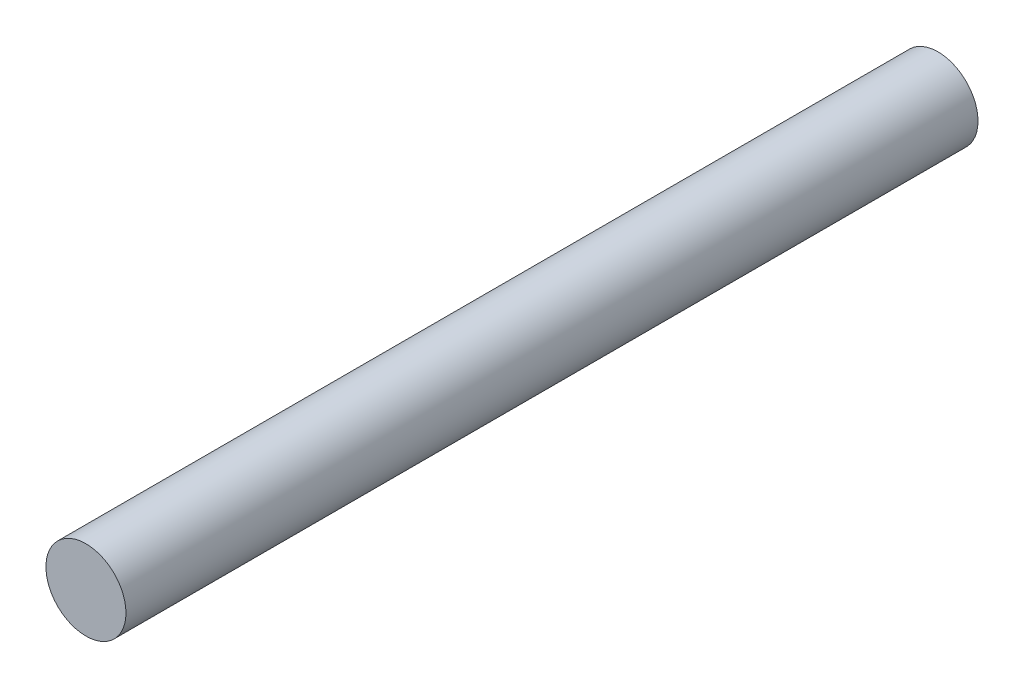
ISO-10303-21;
HEADER;
FILE_DESCRIPTION(('STEP AP214'),'2;1');
FILE_NAME('part.step','',(''),(''),'','','');
FILE_SCHEMA(('AUTOMOTIVE_DESIGN { 1 0 10303 214 1 1 1 1 }'));
ENDSEC;
DATA;
#1=APPLICATION_CONTEXT('core data for automotive mechanical design processes');
#2=APPLICATION_PROTOCOL_DEFINITION('international standard','automotive_design',2000,#1);
#3=PRODUCT_CONTEXT('',#1,'mechanical');
#4=PRODUCT('Part','Part','',(#3));
#5=PRODUCT_RELATED_PRODUCT_CATEGORY('part','',(#4));
#6=PRODUCT_DEFINITION_FORMATION('','',#4);
#7=PRODUCT_DEFINITION_CONTEXT('part definition',#1,'design');
#8=PRODUCT_DEFINITION('design','',#6,#7);
#9=PRODUCT_DEFINITION_SHAPE('','',#8);
#10=(LENGTH_UNIT() NAMED_UNIT(*) SI_UNIT(.MILLI.,.METRE.));
#11=(NAMED_UNIT(*) PLANE_ANGLE_UNIT() SI_UNIT($,.RADIAN.));
#12=(NAMED_UNIT(*) SI_UNIT($,.STERADIAN.) SOLID_ANGLE_UNIT());
#13=UNCERTAINTY_MEASURE_WITH_UNIT(LENGTH_MEASURE(1.E-05),#10,'distance_accuracy_value','');
#14=(GEOMETRIC_REPRESENTATION_CONTEXT(3) GLOBAL_UNCERTAINTY_ASSIGNED_CONTEXT((#13)) GLOBAL_UNIT_ASSIGNED_CONTEXT((#10,
#11,#12)) REPRESENTATION_CONTEXT('',''));
#15=CARTESIAN_POINT('',(0.,0.,0.));
#16=DIRECTION('',(0.,0.,1.));
#17=DIRECTION('',(1.,0.,0.));
#18=AXIS2_PLACEMENT_3D('',#15,#16,#17);
#19=CARTESIAN_POINT('',(-59.1684631693239,-55.7547587116191,101.14));
#20=DIRECTION('',(0.,0.,-1.));
#21=DIRECTION('',(-1.,0.,0.));
#22=AXIS2_PLACEMENT_3D('',#19,#20,#21);
#23=CYLINDRICAL_SURFACE('',#22,4.75);
#24=CARTESIAN_POINT('',(-59.1684631693239,-55.7547587116191,101.14));
#25=DIRECTION('',(0.,0.,1.));
#26=DIRECTION('',(1.,0.,0.));
#27=AXIS2_PLACEMENT_3D('',#24,#25,#26);
#28=CIRCLE('',#27,4.75);
#29=CARTESIAN_POINT('',(-54.4184631693239,-55.7547587116191,101.14));
#30=VERTEX_POINT('',#29);
#31=EDGE_CURVE('E10',#30,#30,#28,.T.);
#32=ORIENTED_EDGE('',*,*,#31,.F.);
#33=EDGE_LOOP('',(#32));
#34=FACE_BOUND('',#33,.T.);
#35=CARTESIAN_POINT('',(-59.1684631693239,-55.7547587116191,0.));
#36=DIRECTION('',(0.,0.,1.));
#37=DIRECTION('',(1.,0.,0.));
#38=AXIS2_PLACEMENT_3D('',#35,#36,#37);
#39=CIRCLE('',#38,4.75);
#40=CARTESIAN_POINT('',(-54.4184631693239,-55.7547587116191,0.));
#41=VERTEX_POINT('',#40);
#42=EDGE_CURVE('E18',#41,#41,#39,.T.);
#43=ORIENTED_EDGE('',*,*,#42,.T.);
#44=EDGE_LOOP('',(#43));
#45=FACE_BOUND('',#44,.T.);
#46=ADVANCED_FACE('F15',(#34,#45),#23,.T.);
#47=CARTESIAN_POINT('',(-59.1684631693239,-55.7547587116191,101.14));
#48=DIRECTION('',(0.,0.,1.));
#49=DIRECTION('',(1.,0.,0.));
#50=AXIS2_PLACEMENT_3D('',#47,#48,#49);
#51=PLANE('',#50);
#52=ORIENTED_EDGE('',*,*,#31,.T.);
#53=EDGE_LOOP('',(#52));
#54=FACE_BOUND('',#53,.T.);
#55=ADVANCED_FACE('F30',(#54),#51,.T.);
#56=CARTESIAN_POINT('',(-59.1684631693239,-55.7547587116191,0.));
#57=DIRECTION('',(0.,0.,1.));
#58=DIRECTION('',(1.,0.,0.));
#59=AXIS2_PLACEMENT_3D('',#56,#57,#58);
#60=PLANE('',#59);
#61=ORIENTED_EDGE('',*,*,#42,.F.);
#62=EDGE_LOOP('',(#61));
#63=FACE_BOUND('',#62,.T.);
#64=ADVANCED_FACE('F28',(#63),#60,.F.);
#65=CLOSED_SHELL('',(#46,#55,#64));
#66=MANIFOLD_SOLID_BREP('B1',#65);
#67=ADVANCED_BREP_SHAPE_REPRESENTATION('',(#18,#66),#14);
#68=SHAPE_DEFINITION_REPRESENTATION(#9,#67);
ENDSEC;
END-ISO-10303-21;
